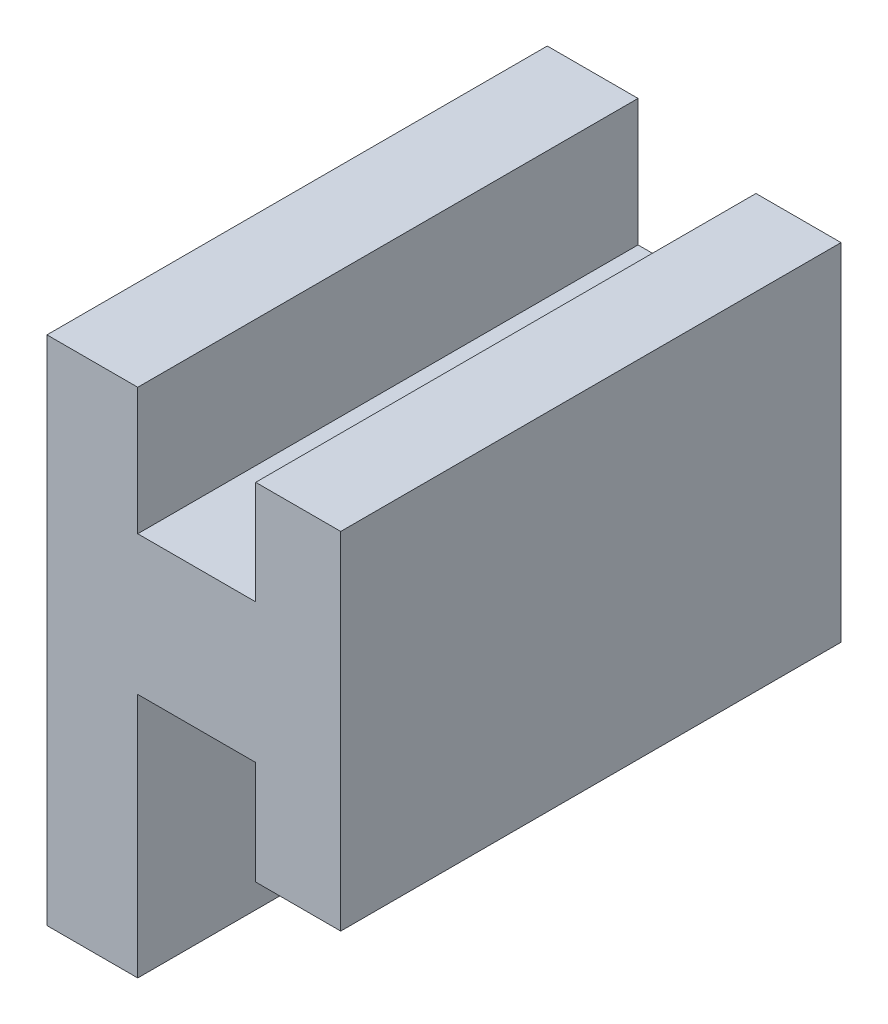
ISO-10303-21;
HEADER;
FILE_DESCRIPTION(('STEP AP214'),'2;1');
FILE_NAME('part.step','',(''),(''),'','','');
FILE_SCHEMA(('AUTOMOTIVE_DESIGN { 1 0 10303 214 1 1 1 1 }'));
ENDSEC;
DATA;
#1=APPLICATION_CONTEXT('core data for automotive mechanical design processes');
#2=APPLICATION_PROTOCOL_DEFINITION('international standard','automotive_design',2000,#1);
#3=PRODUCT_CONTEXT('',#1,'mechanical');
#4=PRODUCT('Part','Part','',(#3));
#5=PRODUCT_RELATED_PRODUCT_CATEGORY('part','',(#4));
#6=PRODUCT_DEFINITION_FORMATION('','',#4);
#7=PRODUCT_DEFINITION_CONTEXT('part definition',#1,'design');
#8=PRODUCT_DEFINITION('design','',#6,#7);
#9=PRODUCT_DEFINITION_SHAPE('','',#8);
#10=(LENGTH_UNIT() NAMED_UNIT(*) SI_UNIT(.MILLI.,.METRE.));
#11=(NAMED_UNIT(*) PLANE_ANGLE_UNIT() SI_UNIT($,.RADIAN.));
#12=(NAMED_UNIT(*) SI_UNIT($,.STERADIAN.) SOLID_ANGLE_UNIT());
#13=UNCERTAINTY_MEASURE_WITH_UNIT(LENGTH_MEASURE(1.E-05),#10,'distance_accuracy_value','');
#14=(GEOMETRIC_REPRESENTATION_CONTEXT(3) GLOBAL_UNCERTAINTY_ASSIGNED_CONTEXT((#13)) GLOBAL_UNIT_ASSIGNED_CONTEXT((#10,
#11,#12)) REPRESENTATION_CONTEXT('',''));
#15=CARTESIAN_POINT('',(0.,0.,0.));
#16=DIRECTION('',(0.,0.,1.));
#17=DIRECTION('',(1.,0.,0.));
#18=AXIS2_PLACEMENT_3D('',#15,#16,#17);
#19=CARTESIAN_POINT('',(-33.9644307588151,-9.68302384075596,-10.));
#20=DIRECTION('',(0.,1.,0.));
#21=DIRECTION('',(0.,0.,1.));
#22=AXIS2_PLACEMENT_3D('',#19,#20,#21);
#23=PLANE('',#22);
#24=DIRECTION('',(-1.,0.,0.));
#25=VECTOR('',#24,1.);
#26=CARTESIAN_POINT('',(-33.9644307588151,-9.68302384075596,0.));
#27=LINE('',#26,#25);
#28=CARTESIAN_POINT('',(-32.1499999999999,-9.68302384075596,0.));
#29=VERTEX_POINT('',#28);
#30=CARTESIAN_POINT('',(-33.9644307588151,-9.68302384075596,0.));
#31=VERTEX_POINT('',#30);
#32=EDGE_CURVE('E154',#29,#31,#27,.T.);
#33=ORIENTED_EDGE('',*,*,#32,.F.);
#34=DIRECTION('',(0.,0.,1.));
#35=VECTOR('',#34,1.);
#36=CARTESIAN_POINT('',(-32.1499999999999,-9.68302384075596,-10.));
#37=LINE('',#36,#35);
#38=CARTESIAN_POINT('',(-32.1499999999999,-9.68302384075596,-10.));
#39=VERTEX_POINT('',#38);
#40=EDGE_CURVE('E11',#39,#29,#37,.T.);
#41=ORIENTED_EDGE('',*,*,#40,.F.);
#42=DIRECTION('',(-1.,0.,0.));
#43=VECTOR('',#42,1.);
#44=CARTESIAN_POINT('',(-33.9644307588151,-9.68302384075596,-10.));
#45=LINE('',#44,#43);
#46=CARTESIAN_POINT('',(-33.9644307588151,-9.68302384075596,-10.));
#47=VERTEX_POINT('',#46);
#48=EDGE_CURVE('E186',#39,#47,#45,.T.);
#49=ORIENTED_EDGE('',*,*,#48,.T.);
#50=DIRECTION('',(0.,0.,1.));
#51=VECTOR('',#50,1.);
#52=CARTESIAN_POINT('',(-33.9644307588151,-9.68302384075596,-10.));
#53=LINE('',#52,#51);
#54=EDGE_CURVE('E36',#47,#31,#53,.T.);
#55=ORIENTED_EDGE('',*,*,#54,.T.);
#56=EDGE_LOOP('',(#33,#41,#49,#55));
#57=FACE_BOUND('',#56,.T.);
#58=ADVANCED_FACE('F33',(#57),#23,.T.);
#59=CARTESIAN_POINT('',(-32.1499999999999,-9.68302384075596,-10.));
#60=DIRECTION('',(1.,0.,0.));
#61=DIRECTION('',(0.,0.,-1.));
#62=AXIS2_PLACEMENT_3D('',#59,#60,#61);
#63=PLANE('',#62);
#64=DIRECTION('',(0.,1.,0.));
#65=VECTOR('',#64,1.);
#66=CARTESIAN_POINT('',(-32.1499999999999,-9.68302384075596,0.));
#67=LINE('',#66,#65);
#68=CARTESIAN_POINT('',(-32.1499999999999,-12.2192177220203,0.));
#69=VERTEX_POINT('',#68);
#70=EDGE_CURVE('E184',#69,#29,#67,.T.);
#71=ORIENTED_EDGE('',*,*,#70,.F.);
#72=DIRECTION('',(0.,0.,1.));
#73=VECTOR('',#72,1.);
#74=CARTESIAN_POINT('',(-32.1499999999999,-12.2192177220203,-10.));
#75=LINE('',#74,#73);
#76=CARTESIAN_POINT('',(-32.1499999999999,-12.2192177220203,-10.));
#77=VERTEX_POINT('',#76);
#78=EDGE_CURVE('E42',#77,#69,#75,.T.);
#79=ORIENTED_EDGE('',*,*,#78,.F.);
#80=DIRECTION('',(0.,1.,0.));
#81=VECTOR('',#80,1.);
#82=CARTESIAN_POINT('',(-32.1499999999999,-9.68302384075596,-10.));
#83=LINE('',#82,#81);
#84=EDGE_CURVE('E144',#77,#39,#83,.T.);
#85=ORIENTED_EDGE('',*,*,#84,.T.);
#86=ORIENTED_EDGE('',*,*,#40,.T.);
#87=EDGE_LOOP('',(#71,#79,#85,#86));
#88=FACE_BOUND('',#87,.T.);
#89=ADVANCED_FACE('F206',(#88),#63,.T.);
#90=CARTESIAN_POINT('',(-32.1499999999999,-12.2192177220203,-10.));
#91=DIRECTION('',(0.,1.,0.));
#92=DIRECTION('',(0.,0.,1.));
#93=AXIS2_PLACEMENT_3D('',#90,#91,#92);
#94=PLANE('',#93);
#95=DIRECTION('',(-1.,0.,0.));
#96=VECTOR('',#95,1.);
#97=CARTESIAN_POINT('',(-32.1499999999999,-12.2192177220203,0.));
#98=LINE('',#97,#96);
#99=CARTESIAN_POINT('',(-29.7927979056844,-12.2192177220203,0.));
#100=VERTEX_POINT('',#99);
#101=EDGE_CURVE('E131',#100,#69,#98,.T.);
#102=ORIENTED_EDGE('',*,*,#101,.F.);
#103=DIRECTION('',(0.,0.,1.));
#104=VECTOR('',#103,1.);
#105=CARTESIAN_POINT('',(-29.7927979056844,-12.2192177220203,-10.));
#106=LINE('',#105,#104);
#107=CARTESIAN_POINT('',(-29.7927979056844,-12.2192177220203,-10.));
#108=VERTEX_POINT('',#107);
#109=EDGE_CURVE('E126',#108,#100,#106,.T.);
#110=ORIENTED_EDGE('',*,*,#109,.F.);
#111=DIRECTION('',(-1.,0.,0.));
#112=VECTOR('',#111,1.);
#113=CARTESIAN_POINT('',(-32.1499999999999,-12.2192177220203,-10.));
#114=LINE('',#113,#112);
#115=EDGE_CURVE('E129',#108,#77,#114,.T.);
#116=ORIENTED_EDGE('',*,*,#115,.T.);
#117=ORIENTED_EDGE('',*,*,#78,.T.);
#118=EDGE_LOOP('',(#102,#110,#116,#117));
#119=FACE_BOUND('',#118,.T.);
#120=ADVANCED_FACE('F128',(#119),#94,.T.);
#121=CARTESIAN_POINT('',(-29.7927979056844,-12.2192177220203,-10.));
#122=DIRECTION('',(-1.,0.,0.));
#123=DIRECTION('',(0.,0.,1.));
#124=AXIS2_PLACEMENT_3D('',#121,#122,#123);
#125=PLANE('',#124);
#126=DIRECTION('',(0.,-1.,0.));
#127=VECTOR('',#126,1.);
#128=CARTESIAN_POINT('',(-29.7927979056844,-12.2192177220203,0.));
#129=LINE('',#128,#127);
#130=CARTESIAN_POINT('',(-29.7927979056844,-10.15,0.));
#131=VERTEX_POINT('',#130);
#132=EDGE_CURVE('E181',#131,#100,#129,.T.);
#133=ORIENTED_EDGE('',*,*,#132,.F.);
#134=DIRECTION('',(0.,0.,1.));
#135=VECTOR('',#134,1.);
#136=CARTESIAN_POINT('',(-29.7927979056844,-10.15,-10.));
#137=LINE('',#136,#135);
#138=CARTESIAN_POINT('',(-29.7927979056844,-10.15,-10.));
#139=VERTEX_POINT('',#138);
#140=EDGE_CURVE('E136',#139,#131,#137,.T.);
#141=ORIENTED_EDGE('',*,*,#140,.F.);
#142=DIRECTION('',(0.,-1.,0.));
#143=VECTOR('',#142,1.);
#144=CARTESIAN_POINT('',(-29.7927979056844,-12.2192177220203,-10.));
#145=LINE('',#144,#143);
#146=EDGE_CURVE('E142',#139,#108,#145,.T.);
#147=ORIENTED_EDGE('',*,*,#146,.T.);
#148=ORIENTED_EDGE('',*,*,#109,.T.);
#149=EDGE_LOOP('',(#133,#141,#147,#148));
#150=FACE_BOUND('',#149,.T.);
#151=ADVANCED_FACE('F146',(#150),#125,.T.);
#152=CARTESIAN_POINT('',(-29.7927979056844,-10.15,-10.));
#153=DIRECTION('',(0.,1.,0.));
#154=DIRECTION('',(0.,0.,1.));
#155=AXIS2_PLACEMENT_3D('',#152,#153,#154);
#156=PLANE('',#155);
#157=DIRECTION('',(-1.,0.,0.));
#158=VECTOR('',#157,1.);
#159=CARTESIAN_POINT('',(-29.7927979056844,-10.15,0.));
#160=LINE('',#159,#158);
#161=CARTESIAN_POINT('',(-28.0927979056844,-10.15,0.));
#162=VERTEX_POINT('',#161);
#163=EDGE_CURVE('E178',#162,#131,#160,.T.);
#164=ORIENTED_EDGE('',*,*,#163,.F.);
#165=DIRECTION('',(0.,0.,1.));
#166=VECTOR('',#165,1.);
#167=CARTESIAN_POINT('',(-28.0927979056844,-10.15,-10.));
#168=LINE('',#167,#166);
#169=CARTESIAN_POINT('',(-28.0927979056844,-10.15,-10.));
#170=VERTEX_POINT('',#169);
#171=EDGE_CURVE('E190',#170,#162,#168,.T.);
#172=ORIENTED_EDGE('',*,*,#171,.F.);
#173=DIRECTION('',(-1.,0.,0.));
#174=VECTOR('',#173,1.);
#175=CARTESIAN_POINT('',(-29.7927979056844,-10.15,-10.));
#176=LINE('',#175,#174);
#177=EDGE_CURVE('E147',#170,#139,#176,.T.);
#178=ORIENTED_EDGE('',*,*,#177,.T.);
#179=ORIENTED_EDGE('',*,*,#140,.T.);
#180=EDGE_LOOP('',(#164,#172,#178,#179));
#181=FACE_BOUND('',#180,.T.);
#182=ADVANCED_FACE('F219',(#181),#156,.T.);
#183=CARTESIAN_POINT('',(-28.0927979056844,-10.15,-10.));
#184=DIRECTION('',(1.,0.,0.));
#185=DIRECTION('',(0.,0.,-1.));
#186=AXIS2_PLACEMENT_3D('',#183,#184,#185);
#187=PLANE('',#186);
#188=DIRECTION('',(0.,1.,0.));
#189=VECTOR('',#188,1.);
#190=CARTESIAN_POINT('',(-28.0927979056844,-10.15,0.));
#191=LINE('',#190,#189);
#192=CARTESIAN_POINT('',(-28.0927979056844,-17.0688691741385,0.));
#193=VERTEX_POINT('',#192);
#194=EDGE_CURVE('E175',#193,#162,#191,.T.);
#195=ORIENTED_EDGE('',*,*,#194,.F.);
#196=DIRECTION('',(0.,0.,1.));
#197=VECTOR('',#196,1.);
#198=CARTESIAN_POINT('',(-28.0927979056844,-17.0688691741385,-10.));
#199=LINE('',#198,#197);
#200=CARTESIAN_POINT('',(-28.0927979056844,-17.0688691741385,-10.));
#201=VERTEX_POINT('',#200);
#202=EDGE_CURVE('E192',#201,#193,#199,.T.);
#203=ORIENTED_EDGE('',*,*,#202,.F.);
#204=DIRECTION('',(0.,1.,0.));
#205=VECTOR('',#204,1.);
#206=CARTESIAN_POINT('',(-28.0927979056844,-10.15,-10.));
#207=LINE('',#206,#205);
#208=EDGE_CURVE('E149',#201,#170,#207,.T.);
#209=ORIENTED_EDGE('',*,*,#208,.T.);
#210=ORIENTED_EDGE('',*,*,#171,.T.);
#211=EDGE_LOOP('',(#195,#203,#209,#210));
#212=FACE_BOUND('',#211,.T.);
#213=ADVANCED_FACE('F222',(#212),#187,.T.);
#214=CARTESIAN_POINT('',(-28.0927979056844,-17.0688691741385,-10.));
#215=DIRECTION('',(0.,-1.,0.));
#216=DIRECTION('',(0.,0.,-1.));
#217=AXIS2_PLACEMENT_3D('',#214,#215,#216);
#218=PLANE('',#217);
#219=DIRECTION('',(1.,0.,0.));
#220=VECTOR('',#219,1.);
#221=CARTESIAN_POINT('',(-28.0927979056844,-17.0688691741385,0.));
#222=LINE('',#221,#220);
#223=CARTESIAN_POINT('',(-29.7927979056844,-17.0688691741385,0.));
#224=VERTEX_POINT('',#223);
#225=EDGE_CURVE('E172',#224,#193,#222,.T.);
#226=ORIENTED_EDGE('',*,*,#225,.F.);
#227=DIRECTION('',(0.,0.,1.));
#228=VECTOR('',#227,1.);
#229=CARTESIAN_POINT('',(-29.7927979056844,-17.0688691741385,-10.));
#230=LINE('',#229,#228);
#231=CARTESIAN_POINT('',(-29.7927979056844,-17.0688691741385,-10.));
#232=VERTEX_POINT('',#231);
#233=EDGE_CURVE('E194',#232,#224,#230,.T.);
#234=ORIENTED_EDGE('',*,*,#233,.F.);
#235=DIRECTION('',(1.,0.,0.));
#236=VECTOR('',#235,1.);
#237=CARTESIAN_POINT('',(-28.0927979056844,-17.0688691741385,-10.));
#238=LINE('',#237,#236);
#239=EDGE_CURVE('E348',#232,#201,#238,.T.);
#240=ORIENTED_EDGE('',*,*,#239,.T.);
#241=ORIENTED_EDGE('',*,*,#202,.T.);
#242=EDGE_LOOP('',(#226,#234,#240,#241));
#243=FACE_BOUND('',#242,.T.);
#244=ADVANCED_FACE('F226',(#243),#218,.T.);
#245=CARTESIAN_POINT('',(-29.7927979056844,-17.0688691741385,-10.));
#246=DIRECTION('',(-1.,0.,0.));
#247=DIRECTION('',(0.,0.,1.));
#248=AXIS2_PLACEMENT_3D('',#245,#246,#247);
#249=PLANE('',#248);
#250=DIRECTION('',(0.,-1.,0.));
#251=VECTOR('',#250,1.);
#252=CARTESIAN_POINT('',(-29.7927979056844,-17.0688691741385,0.));
#253=LINE('',#252,#251);
#254=CARTESIAN_POINT('',(-29.7927979056844,-14.9996514521183,0.));
#255=VERTEX_POINT('',#254);
#256=EDGE_CURVE('E169',#255,#224,#253,.T.);
#257=ORIENTED_EDGE('',*,*,#256,.F.);
#258=DIRECTION('',(0.,0.,1.));
#259=VECTOR('',#258,1.);
#260=CARTESIAN_POINT('',(-29.7927979056844,-14.9996514521183,-10.));
#261=LINE('',#260,#259);
#262=CARTESIAN_POINT('',(-29.7927979056844,-14.9996514521183,-10.));
#263=VERTEX_POINT('',#262);
#264=EDGE_CURVE('E196',#263,#255,#261,.T.);
#265=ORIENTED_EDGE('',*,*,#264,.F.);
#266=DIRECTION('',(0.,-1.,0.));
#267=VECTOR('',#266,1.);
#268=CARTESIAN_POINT('',(-29.7927979056844,-17.0688691741385,-10.));
#269=LINE('',#268,#267);
#270=EDGE_CURVE('E352',#263,#232,#269,.T.);
#271=ORIENTED_EDGE('',*,*,#270,.T.);
#272=ORIENTED_EDGE('',*,*,#233,.T.);
#273=EDGE_LOOP('',(#257,#265,#271,#272));
#274=FACE_BOUND('',#273,.T.);
#275=ADVANCED_FACE('F230',(#274),#249,.T.);
#276=CARTESIAN_POINT('',(-29.7927979056844,-14.9996514521183,-10.));
#277=DIRECTION('',(0.,-1.,0.));
#278=DIRECTION('',(0.,0.,-1.));
#279=AXIS2_PLACEMENT_3D('',#276,#277,#278);
#280=PLANE('',#279);
#281=DIRECTION('',(1.,0.,0.));
#282=VECTOR('',#281,1.);
#283=CARTESIAN_POINT('',(-29.7927979056844,-14.9996514521183,0.));
#284=LINE('',#283,#282);
#285=CARTESIAN_POINT('',(-32.15,-14.9996514521183,0.));
#286=VERTEX_POINT('',#285);
#287=EDGE_CURVE('E166',#286,#255,#284,.T.);
#288=ORIENTED_EDGE('',*,*,#287,.F.);
#289=DIRECTION('',(0.,0.,1.));
#290=VECTOR('',#289,1.);
#291=CARTESIAN_POINT('',(-32.15,-14.9996514521183,-10.));
#292=LINE('',#291,#290);
#293=CARTESIAN_POINT('',(-32.15,-14.9996514521183,-10.));
#294=VERTEX_POINT('',#293);
#295=EDGE_CURVE('E198',#294,#286,#292,.T.);
#296=ORIENTED_EDGE('',*,*,#295,.F.);
#297=DIRECTION('',(1.,0.,0.));
#298=VECTOR('',#297,1.);
#299=CARTESIAN_POINT('',(-29.7927979056844,-14.9996514521183,-10.));
#300=LINE('',#299,#298);
#301=EDGE_CURVE('E341',#294,#263,#300,.T.);
#302=ORIENTED_EDGE('',*,*,#301,.T.);
#303=ORIENTED_EDGE('',*,*,#264,.T.);
#304=EDGE_LOOP('',(#288,#296,#302,#303));
#305=FACE_BOUND('',#304,.T.);
#306=ADVANCED_FACE('F234',(#305),#280,.T.);
#307=CARTESIAN_POINT('',(-32.15,-14.9996514521183,-10.));
#308=DIRECTION('',(1.,0.,0.));
#309=DIRECTION('',(0.,0.,-1.));
#310=AXIS2_PLACEMENT_3D('',#307,#308,#309);
#311=PLANE('',#310);
#312=DIRECTION('',(0.,1.,0.));
#313=VECTOR('',#312,1.);
#314=CARTESIAN_POINT('',(-32.15,-14.9996514521183,0.));
#315=LINE('',#314,#313);
#316=CARTESIAN_POINT('',(-32.15,-19.9089821765482,0.));
#317=VERTEX_POINT('',#316);
#318=EDGE_CURVE('E163',#317,#286,#315,.T.);
#319=ORIENTED_EDGE('',*,*,#318,.F.);
#320=DIRECTION('',(0.,0.,1.));
#321=VECTOR('',#320,1.);
#322=CARTESIAN_POINT('',(-32.15,-19.9089821765482,-10.));
#323=LINE('',#322,#321);
#324=CARTESIAN_POINT('',(-32.15,-19.9089821765482,-10.));
#325=VERTEX_POINT('',#324);
#326=EDGE_CURVE('E200',#325,#317,#323,.T.);
#327=ORIENTED_EDGE('',*,*,#326,.F.);
#328=DIRECTION('',(0.,1.,0.));
#329=VECTOR('',#328,1.);
#330=CARTESIAN_POINT('',(-32.15,-14.9996514521183,-10.));
#331=LINE('',#330,#329);
#332=EDGE_CURVE('E337',#325,#294,#331,.T.);
#333=ORIENTED_EDGE('',*,*,#332,.T.);
#334=ORIENTED_EDGE('',*,*,#295,.T.);
#335=EDGE_LOOP('',(#319,#327,#333,#334));
#336=FACE_BOUND('',#335,.T.);
#337=ADVANCED_FACE('F238',(#336),#311,.T.);
#338=CARTESIAN_POINT('',(-32.15,-19.9089821765482,-10.));
#339=DIRECTION('',(0.,-1.,0.));
#340=DIRECTION('',(0.,0.,-1.));
#341=AXIS2_PLACEMENT_3D('',#338,#339,#340);
#342=PLANE('',#341);
#343=DIRECTION('',(1.,0.,0.));
#344=VECTOR('',#343,1.);
#345=CARTESIAN_POINT('',(-32.15,-19.9089821765482,0.));
#346=LINE('',#345,#344);
#347=CARTESIAN_POINT('',(-33.9644307588151,-19.9089821765482,0.));
#348=VERTEX_POINT('',#347);
#349=EDGE_CURVE('E160',#348,#317,#346,.T.);
#350=ORIENTED_EDGE('',*,*,#349,.F.);
#351=DIRECTION('',(0.,0.,1.));
#352=VECTOR('',#351,1.);
#353=CARTESIAN_POINT('',(-33.9644307588151,-19.9089821765482,-10.));
#354=LINE('',#353,#352);
#355=CARTESIAN_POINT('',(-33.9644307588151,-19.9089821765482,-10.));
#356=VERTEX_POINT('',#355);
#357=EDGE_CURVE('E201',#356,#348,#354,.T.);
#358=ORIENTED_EDGE('',*,*,#357,.F.);
#359=DIRECTION('',(1.,0.,0.));
#360=VECTOR('',#359,1.);
#361=CARTESIAN_POINT('',(-32.15,-19.9089821765482,-10.));
#362=LINE('',#361,#360);
#363=EDGE_CURVE('E358',#356,#325,#362,.T.);
#364=ORIENTED_EDGE('',*,*,#363,.T.);
#365=ORIENTED_EDGE('',*,*,#326,.T.);
#366=EDGE_LOOP('',(#350,#358,#364,#365));
#367=FACE_BOUND('',#366,.T.);
#368=ADVANCED_FACE('F242',(#367),#342,.T.);
#369=CARTESIAN_POINT('',(-33.9644307588151,-19.9089821765482,-10.));
#370=DIRECTION('',(-1.,0.,0.));
#371=DIRECTION('',(0.,0.,1.));
#372=AXIS2_PLACEMENT_3D('',#369,#370,#371);
#373=PLANE('',#372);
#374=DIRECTION('',(0.,-1.,0.));
#375=VECTOR('',#374,1.);
#376=CARTESIAN_POINT('',(-33.9644307588151,-19.9089821765482,0.));
#377=LINE('',#376,#375);
#378=EDGE_CURVE('E157',#31,#348,#377,.T.);
#379=ORIENTED_EDGE('',*,*,#378,.F.);
#380=ORIENTED_EDGE('',*,*,#54,.F.);
#381=DIRECTION('',(0.,-1.,0.));
#382=VECTOR('',#381,1.);
#383=CARTESIAN_POINT('',(-33.9644307588151,-19.9089821765482,-10.));
#384=LINE('',#383,#382);
#385=EDGE_CURVE('E360',#47,#356,#384,.T.);
#386=ORIENTED_EDGE('',*,*,#385,.T.);
#387=ORIENTED_EDGE('',*,*,#357,.T.);
#388=EDGE_LOOP('',(#379,#380,#386,#387));
#389=FACE_BOUND('',#388,.T.);
#390=ADVANCED_FACE('F203',(#389),#373,.T.);
#391=CARTESIAN_POINT('',(0.,0.,-10.));
#392=DIRECTION('',(0.,0.,-1.));
#393=DIRECTION('',(-1.,0.,0.));
#394=AXIS2_PLACEMENT_3D('',#391,#392,#393);
#395=PLANE('',#394);
#396=ORIENTED_EDGE('',*,*,#48,.F.);
#397=ORIENTED_EDGE('',*,*,#84,.F.);
#398=ORIENTED_EDGE('',*,*,#115,.F.);
#399=ORIENTED_EDGE('',*,*,#146,.F.);
#400=ORIENTED_EDGE('',*,*,#177,.F.);
#401=ORIENTED_EDGE('',*,*,#208,.F.);
#402=ORIENTED_EDGE('',*,*,#239,.F.);
#403=ORIENTED_EDGE('',*,*,#270,.F.);
#404=ORIENTED_EDGE('',*,*,#301,.F.);
#405=ORIENTED_EDGE('',*,*,#332,.F.);
#406=ORIENTED_EDGE('',*,*,#363,.F.);
#407=ORIENTED_EDGE('',*,*,#385,.F.);
#408=EDGE_LOOP('',(#396,#397,#398,#399,#400,#401,#402,#403,#404,#405,#406,#407));
#409=FACE_BOUND('',#408,.T.);
#410=ADVANCED_FACE('F140',(#409),#395,.T.);
#411=CARTESIAN_POINT('',(0.,0.,0.));
#412=DIRECTION('',(0.,0.,-1.));
#413=DIRECTION('',(-1.,0.,0.));
#414=AXIS2_PLACEMENT_3D('',#411,#412,#413);
#415=PLANE('',#414);
#416=ORIENTED_EDGE('',*,*,#32,.T.);
#417=ORIENTED_EDGE('',*,*,#378,.T.);
#418=ORIENTED_EDGE('',*,*,#349,.T.);
#419=ORIENTED_EDGE('',*,*,#318,.T.);
#420=ORIENTED_EDGE('',*,*,#287,.T.);
#421=ORIENTED_EDGE('',*,*,#256,.T.);
#422=ORIENTED_EDGE('',*,*,#225,.T.);
#423=ORIENTED_EDGE('',*,*,#194,.T.);
#424=ORIENTED_EDGE('',*,*,#163,.T.);
#425=ORIENTED_EDGE('',*,*,#132,.T.);
#426=ORIENTED_EDGE('',*,*,#101,.T.);
#427=ORIENTED_EDGE('',*,*,#70,.T.);
#428=EDGE_LOOP('',(#416,#417,#418,#419,#420,#421,#422,#423,#424,#425,#426,#427));
#429=FACE_BOUND('',#428,.T.);
#430=ADVANCED_FACE('F205',(#429),#415,.F.);
#431=CLOSED_SHELL('',(#58,#89,#120,#151,#182,#213,#244,#275,#306,#337,#368,#390,#410,#430));
#432=MANIFOLD_SOLID_BREP('B2',#431);
#433=ADVANCED_BREP_SHAPE_REPRESENTATION('',(#18,#432),#14);
#434=SHAPE_DEFINITION_REPRESENTATION(#9,#433);
ENDSEC;
END-ISO-10303-21;
